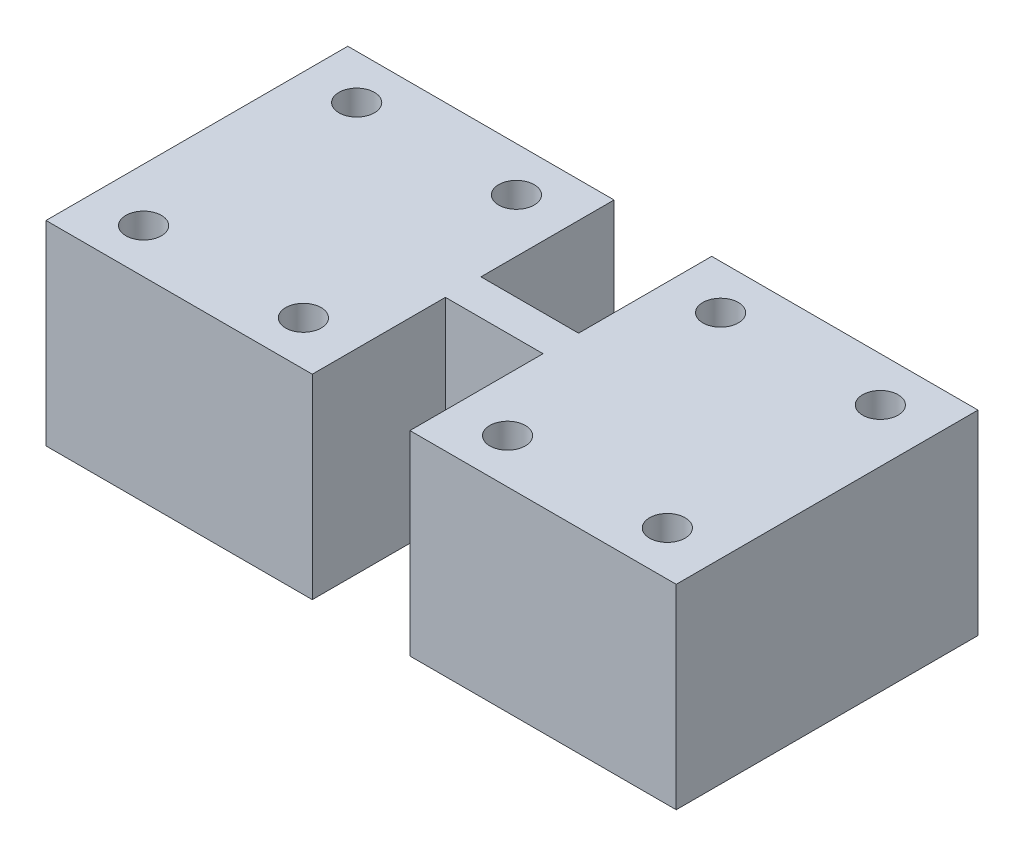
ISO-10303-21;
HEADER;
FILE_DESCRIPTION(('STEP AP214'),'2;1');
FILE_NAME('part.step','',(''),(''),'','','');
FILE_SCHEMA(('AUTOMOTIVE_DESIGN { 1 0 10303 214 1 1 1 1 }'));
ENDSEC;
DATA;
#1=APPLICATION_CONTEXT('core data for automotive mechanical design processes');
#2=APPLICATION_PROTOCOL_DEFINITION('international standard','automotive_design',2000,#1);
#3=PRODUCT_CONTEXT('',#1,'mechanical');
#4=PRODUCT('Part','Part','',(#3));
#5=PRODUCT_RELATED_PRODUCT_CATEGORY('part','',(#4));
#6=PRODUCT_DEFINITION_FORMATION('','',#4);
#7=PRODUCT_DEFINITION_CONTEXT('part definition',#1,'design');
#8=PRODUCT_DEFINITION('design','',#6,#7);
#9=PRODUCT_DEFINITION_SHAPE('','',#8);
#10=(LENGTH_UNIT() NAMED_UNIT(*) SI_UNIT(.MILLI.,.METRE.));
#11=(NAMED_UNIT(*) PLANE_ANGLE_UNIT() SI_UNIT($,.RADIAN.));
#12=(NAMED_UNIT(*) SI_UNIT($,.STERADIAN.) SOLID_ANGLE_UNIT());
#13=UNCERTAINTY_MEASURE_WITH_UNIT(LENGTH_MEASURE(1.E-05),#10,'distance_accuracy_value','');
#14=(GEOMETRIC_REPRESENTATION_CONTEXT(3) GLOBAL_UNCERTAINTY_ASSIGNED_CONTEXT((#13)) GLOBAL_UNIT_ASSIGNED_CONTEXT((#10,
#11,#12)) REPRESENTATION_CONTEXT('',''));
#15=CARTESIAN_POINT('',(0.,0.,0.));
#16=DIRECTION('',(0.,0.,1.));
#17=DIRECTION('',(1.,0.,0.));
#18=AXIS2_PLACEMENT_3D('',#15,#16,#17);
#19=CARTESIAN_POINT('',(0.,22.,0.));
#20=DIRECTION('',(0.,-1.,0.));
#21=DIRECTION('',(0.,0.,-1.));
#22=AXIS2_PLACEMENT_3D('',#19,#20,#21);
#23=PLANE('',#22);
#24=DIRECTION('',(1.,0.,0.));
#25=VECTOR('',#24,1.);
#26=CARTESIAN_POINT('',(30.,22.,0.));
#27=LINE('',#26,#25);
#28=CARTESIAN_POINT('',(0.,22.,0.));
#29=VERTEX_POINT('',#28);
#30=CARTESIAN_POINT('',(30.,22.,0.));
#31=VERTEX_POINT('',#30);
#32=EDGE_CURVE('E178',#29,#31,#27,.T.);
#33=ORIENTED_EDGE('',*,*,#32,.T.);
#34=DIRECTION('',(0.,0.,-1.));
#35=VECTOR('',#34,1.);
#36=CARTESIAN_POINT('',(30.,22.,-15.));
#37=LINE('',#36,#35);
#38=CARTESIAN_POINT('',(30.,22.,-15.));
#39=VERTEX_POINT('',#38);
#40=EDGE_CURVE('E106',#31,#39,#37,.T.);
#41=ORIENTED_EDGE('',*,*,#40,.T.);
#42=DIRECTION('',(1.,0.,0.));
#43=VECTOR('',#42,1.);
#44=CARTESIAN_POINT('',(30.,22.,-15.));
#45=LINE('',#44,#43);
#46=CARTESIAN_POINT('',(41.,22.,-15.));
#47=VERTEX_POINT('',#46);
#48=EDGE_CURVE('E205',#39,#47,#45,.T.);
#49=ORIENTED_EDGE('',*,*,#48,.T.);
#50=DIRECTION('',(0.,0.,1.));
#51=VECTOR('',#50,1.);
#52=CARTESIAN_POINT('',(41.,22.,0.));
#53=LINE('',#52,#51);
#54=CARTESIAN_POINT('',(41.,22.,0.));
#55=VERTEX_POINT('',#54);
#56=EDGE_CURVE('E224',#47,#55,#53,.T.);
#57=ORIENTED_EDGE('',*,*,#56,.T.);
#58=DIRECTION('',(1.,0.,0.));
#59=VECTOR('',#58,1.);
#60=CARTESIAN_POINT('',(71.,22.,0.));
#61=LINE('',#60,#59);
#62=CARTESIAN_POINT('',(71.,22.,0.));
#63=VERTEX_POINT('',#62);
#64=EDGE_CURVE('E221',#55,#63,#61,.T.);
#65=ORIENTED_EDGE('',*,*,#64,.T.);
#66=DIRECTION('',(0.,0.,-1.));
#67=VECTOR('',#66,1.);
#68=CARTESIAN_POINT('',(71.,22.,-34.));
#69=LINE('',#68,#67);
#70=CARTESIAN_POINT('',(71.,22.,-34.));
#71=VERTEX_POINT('',#70);
#72=EDGE_CURVE('E223',#63,#71,#69,.T.);
#73=ORIENTED_EDGE('',*,*,#72,.T.);
#74=DIRECTION('',(-1.,0.,0.));
#75=VECTOR('',#74,1.);
#76=CARTESIAN_POINT('',(41.,22.,-34.));
#77=LINE('',#76,#75);
#78=CARTESIAN_POINT('',(41.,22.,-34.));
#79=VERTEX_POINT('',#78);
#80=EDGE_CURVE('E226',#71,#79,#77,.T.);
#81=ORIENTED_EDGE('',*,*,#80,.T.);
#82=DIRECTION('',(0.,0.,1.));
#83=VECTOR('',#82,1.);
#84=CARTESIAN_POINT('',(41.,22.,-19.));
#85=LINE('',#84,#83);
#86=CARTESIAN_POINT('',(41.,22.,-19.));
#87=VERTEX_POINT('',#86);
#88=EDGE_CURVE('E232',#79,#87,#85,.T.);
#89=ORIENTED_EDGE('',*,*,#88,.T.);
#90=DIRECTION('',(-1.,0.,0.));
#91=VECTOR('',#90,1.);
#92=CARTESIAN_POINT('',(30.,22.,-19.));
#93=LINE('',#92,#91);
#94=CARTESIAN_POINT('',(30.,22.,-19.));
#95=VERTEX_POINT('',#94);
#96=EDGE_CURVE('E137',#87,#95,#93,.T.);
#97=ORIENTED_EDGE('',*,*,#96,.T.);
#98=DIRECTION('',(0.,0.,-1.));
#99=VECTOR('',#98,1.);
#100=CARTESIAN_POINT('',(30.,22.,-34.));
#101=LINE('',#100,#99);
#102=CARTESIAN_POINT('',(30.,22.,-34.));
#103=VERTEX_POINT('',#102);
#104=EDGE_CURVE('E131',#95,#103,#101,.T.);
#105=ORIENTED_EDGE('',*,*,#104,.T.);
#106=DIRECTION('',(-1.,0.,0.));
#107=VECTOR('',#106,1.);
#108=CARTESIAN_POINT('',(0.,22.,-34.));
#109=LINE('',#108,#107);
#110=CARTESIAN_POINT('',(0.,22.,-34.));
#111=VERTEX_POINT('',#110);
#112=EDGE_CURVE('E135',#103,#111,#109,.T.);
#113=ORIENTED_EDGE('',*,*,#112,.T.);
#114=DIRECTION('',(0.,0.,1.));
#115=VECTOR('',#114,1.);
#116=CARTESIAN_POINT('',(0.,22.,0.));
#117=LINE('',#116,#115);
#118=EDGE_CURVE('E51',#111,#29,#117,.T.);
#119=ORIENTED_EDGE('',*,*,#118,.T.);
#120=EDGE_LOOP('',(#33,#41,#49,#57,#65,#73,#81,#89,#97,#105,#113,#119));
#121=FACE_BOUND('',#120,.T.);
#122=CARTESIAN_POINT('',(6.,22.,-29.));
#123=DIRECTION('',(0.,1.,0.));
#124=DIRECTION('',(0.,0.,1.));
#125=AXIS2_PLACEMENT_3D('',#122,#123,#124);
#126=CIRCLE('',#125,2.);
#127=CARTESIAN_POINT('',(6.,22.,-27.));
#128=VERTEX_POINT('',#127);
#129=EDGE_CURVE('E159',#128,#128,#126,.T.);
#130=ORIENTED_EDGE('',*,*,#129,.F.);
#131=EDGE_LOOP('',(#130));
#132=FACE_BOUND('',#131,.T.);
#133=CARTESIAN_POINT('',(24.,22.,-29.));
#134=DIRECTION('',(0.,1.,0.));
#135=DIRECTION('',(0.,0.,-1.));
#136=AXIS2_PLACEMENT_3D('',#133,#134,#135);
#137=CIRCLE('',#136,2.00000000000001);
#138=CARTESIAN_POINT('',(24.,22.,-31.));
#139=VERTEX_POINT('',#138);
#140=EDGE_CURVE('E336',#139,#139,#137,.T.);
#141=ORIENTED_EDGE('',*,*,#140,.F.);
#142=EDGE_LOOP('',(#141));
#143=FACE_BOUND('',#142,.T.);
#144=CARTESIAN_POINT('',(24.,22.,-5.));
#145=DIRECTION('',(0.,1.,0.));
#146=DIRECTION('',(0.,0.,1.));
#147=AXIS2_PLACEMENT_3D('',#144,#145,#146);
#148=CIRCLE('',#147,2.);
#149=CARTESIAN_POINT('',(24.,22.,-3.));
#150=VERTEX_POINT('',#149);
#151=EDGE_CURVE('E330',#150,#150,#148,.T.);
#152=ORIENTED_EDGE('',*,*,#151,.F.);
#153=EDGE_LOOP('',(#152));
#154=FACE_BOUND('',#153,.T.);
#155=CARTESIAN_POINT('',(6.,22.,-5.));
#156=DIRECTION('',(0.,1.,0.));
#157=DIRECTION('',(0.,0.,-1.));
#158=AXIS2_PLACEMENT_3D('',#155,#156,#157);
#159=CIRCLE('',#158,2.);
#160=CARTESIAN_POINT('',(6.,22.,-7.));
#161=VERTEX_POINT('',#160);
#162=EDGE_CURVE('E324',#161,#161,#159,.T.);
#163=ORIENTED_EDGE('',*,*,#162,.F.);
#164=EDGE_LOOP('',(#163));
#165=FACE_BOUND('',#164,.T.);
#166=CARTESIAN_POINT('',(47.,22.,-29.));
#167=DIRECTION('',(0.,1.,0.));
#168=DIRECTION('',(0.,0.,1.));
#169=AXIS2_PLACEMENT_3D('',#166,#167,#168);
#170=CIRCLE('',#169,2.);
#171=CARTESIAN_POINT('',(47.,22.,-27.));
#172=VERTEX_POINT('',#171);
#173=EDGE_CURVE('E318',#172,#172,#170,.T.);
#174=ORIENTED_EDGE('',*,*,#173,.F.);
#175=EDGE_LOOP('',(#174));
#176=FACE_BOUND('',#175,.T.);
#177=CARTESIAN_POINT('',(47.,22.,-4.99999999999999));
#178=DIRECTION('',(0.,1.,0.));
#179=DIRECTION('',(0.,0.,-1.));
#180=AXIS2_PLACEMENT_3D('',#177,#178,#179);
#181=CIRCLE('',#180,2.);
#182=CARTESIAN_POINT('',(47.,22.,-7.));
#183=VERTEX_POINT('',#182);
#184=EDGE_CURVE('E312',#183,#183,#181,.T.);
#185=ORIENTED_EDGE('',*,*,#184,.F.);
#186=EDGE_LOOP('',(#185));
#187=FACE_BOUND('',#186,.T.);
#188=CARTESIAN_POINT('',(65.,22.,-4.99999999999999));
#189=DIRECTION('',(0.,1.,0.));
#190=DIRECTION('',(0.,0.,1.));
#191=AXIS2_PLACEMENT_3D('',#188,#189,#190);
#192=CIRCLE('',#191,2.00000000000001);
#193=CARTESIAN_POINT('',(65.,22.,-2.99999999999998));
#194=VERTEX_POINT('',#193);
#195=EDGE_CURVE('E306',#194,#194,#192,.T.);
#196=ORIENTED_EDGE('',*,*,#195,.F.);
#197=EDGE_LOOP('',(#196));
#198=FACE_BOUND('',#197,.T.);
#199=CARTESIAN_POINT('',(65.,22.,-29.));
#200=DIRECTION('',(0.,1.,0.));
#201=DIRECTION('',(0.,0.,-1.));
#202=AXIS2_PLACEMENT_3D('',#199,#200,#201);
#203=CIRCLE('',#202,2.00000000000001);
#204=CARTESIAN_POINT('',(65.,22.,-31.));
#205=VERTEX_POINT('',#204);
#206=EDGE_CURVE('E297',#205,#205,#203,.T.);
#207=ORIENTED_EDGE('',*,*,#206,.F.);
#208=EDGE_LOOP('',(#207));
#209=FACE_BOUND('',#208,.T.);
#210=ADVANCED_FACE('F34',(#121,#132,#143,#154,#165,#176,#187,#198,#209),#23,.F.);
#211=CARTESIAN_POINT('',(0.,0.,0.));
#212=DIRECTION('',(0.,-1.,0.));
#213=DIRECTION('',(0.,0.,-1.));
#214=AXIS2_PLACEMENT_3D('',#211,#212,#213);
#215=PLANE('',#214);
#216=CARTESIAN_POINT('',(65.,0.,-4.99999999999999));
#217=DIRECTION('',(0.,1.,0.));
#218=DIRECTION('',(0.,0.,1.));
#219=AXIS2_PLACEMENT_3D('',#216,#217,#218);
#220=CIRCLE('',#219,2.00000000000001);
#221=CARTESIAN_POINT('',(65.,0.,-2.99999999999998));
#222=VERTEX_POINT('',#221);
#223=EDGE_CURVE('E303',#222,#222,#220,.T.);
#224=ORIENTED_EDGE('',*,*,#223,.T.);
#225=EDGE_LOOP('',(#224));
#226=FACE_BOUND('',#225,.T.);
#227=CARTESIAN_POINT('',(47.,0.,-29.));
#228=DIRECTION('',(0.,1.,0.));
#229=DIRECTION('',(0.,0.,1.));
#230=AXIS2_PLACEMENT_3D('',#227,#228,#229);
#231=CIRCLE('',#230,2.);
#232=CARTESIAN_POINT('',(47.,0.,-27.));
#233=VERTEX_POINT('',#232);
#234=EDGE_CURVE('E315',#233,#233,#231,.T.);
#235=ORIENTED_EDGE('',*,*,#234,.T.);
#236=EDGE_LOOP('',(#235));
#237=FACE_BOUND('',#236,.T.);
#238=CARTESIAN_POINT('',(24.,0.,-5.));
#239=DIRECTION('',(0.,1.,0.));
#240=DIRECTION('',(0.,0.,1.));
#241=AXIS2_PLACEMENT_3D('',#238,#239,#240);
#242=CIRCLE('',#241,2.);
#243=CARTESIAN_POINT('',(24.,0.,-3.));
#244=VERTEX_POINT('',#243);
#245=EDGE_CURVE('E327',#244,#244,#242,.T.);
#246=ORIENTED_EDGE('',*,*,#245,.T.);
#247=EDGE_LOOP('',(#246));
#248=FACE_BOUND('',#247,.T.);
#249=CARTESIAN_POINT('',(6.,0.,-29.));
#250=DIRECTION('',(0.,1.,0.));
#251=DIRECTION('',(0.,0.,1.));
#252=AXIS2_PLACEMENT_3D('',#249,#250,#251);
#253=CIRCLE('',#252,2.);
#254=CARTESIAN_POINT('',(6.,0.,-27.));
#255=VERTEX_POINT('',#254);
#256=EDGE_CURVE('E339',#255,#255,#253,.T.);
#257=ORIENTED_EDGE('',*,*,#256,.T.);
#258=EDGE_LOOP('',(#257));
#259=FACE_BOUND('',#258,.T.);
#260=DIRECTION('',(1.,0.,0.));
#261=VECTOR('',#260,1.);
#262=CARTESIAN_POINT('',(30.,0.,0.));
#263=LINE('',#262,#261);
#264=CARTESIAN_POINT('',(0.,0.,0.));
#265=VERTEX_POINT('',#264);
#266=CARTESIAN_POINT('',(30.,0.,0.));
#267=VERTEX_POINT('',#266);
#268=EDGE_CURVE('E155',#265,#267,#263,.T.);
#269=ORIENTED_EDGE('',*,*,#268,.F.);
#270=DIRECTION('',(0.,0.,1.));
#271=VECTOR('',#270,1.);
#272=CARTESIAN_POINT('',(0.,0.,0.));
#273=LINE('',#272,#271);
#274=CARTESIAN_POINT('',(0.,0.,-34.));
#275=VERTEX_POINT('',#274);
#276=EDGE_CURVE('E98',#275,#265,#273,.T.);
#277=ORIENTED_EDGE('',*,*,#276,.F.);
#278=DIRECTION('',(-1.,0.,0.));
#279=VECTOR('',#278,1.);
#280=CARTESIAN_POINT('',(0.,0.,-34.));
#281=LINE('',#280,#279);
#282=CARTESIAN_POINT('',(30.,0.,-34.));
#283=VERTEX_POINT('',#282);
#284=EDGE_CURVE('E92',#283,#275,#281,.T.);
#285=ORIENTED_EDGE('',*,*,#284,.F.);
#286=DIRECTION('',(0.,0.,-1.));
#287=VECTOR('',#286,1.);
#288=CARTESIAN_POINT('',(30.,0.,-34.));
#289=LINE('',#288,#287);
#290=CARTESIAN_POINT('',(30.,0.,-19.));
#291=VERTEX_POINT('',#290);
#292=EDGE_CURVE('E145',#291,#283,#289,.T.);
#293=ORIENTED_EDGE('',*,*,#292,.F.);
#294=DIRECTION('',(-1.,0.,0.));
#295=VECTOR('',#294,1.);
#296=CARTESIAN_POINT('',(30.,0.,-19.));
#297=LINE('',#296,#295);
#298=CARTESIAN_POINT('',(41.,0.,-19.));
#299=VERTEX_POINT('',#298);
#300=EDGE_CURVE('E173',#299,#291,#297,.T.);
#301=ORIENTED_EDGE('',*,*,#300,.F.);
#302=DIRECTION('',(0.,0.,1.));
#303=VECTOR('',#302,1.);
#304=CARTESIAN_POINT('',(41.,0.,-19.));
#305=LINE('',#304,#303);
#306=CARTESIAN_POINT('',(41.,0.,-34.));
#307=VERTEX_POINT('',#306);
#308=EDGE_CURVE('E171',#307,#299,#305,.T.);
#309=ORIENTED_EDGE('',*,*,#308,.F.);
#310=DIRECTION('',(-1.,0.,0.));
#311=VECTOR('',#310,1.);
#312=CARTESIAN_POINT('',(41.,0.,-34.));
#313=LINE('',#312,#311);
#314=CARTESIAN_POINT('',(71.,0.,-34.));
#315=VERTEX_POINT('',#314);
#316=EDGE_CURVE('E169',#315,#307,#313,.T.);
#317=ORIENTED_EDGE('',*,*,#316,.F.);
#318=DIRECTION('',(0.,0.,-1.));
#319=VECTOR('',#318,1.);
#320=CARTESIAN_POINT('',(71.,0.,-34.));
#321=LINE('',#320,#319);
#322=CARTESIAN_POINT('',(71.,0.,0.));
#323=VERTEX_POINT('',#322);
#324=EDGE_CURVE('E167',#323,#315,#321,.T.);
#325=ORIENTED_EDGE('',*,*,#324,.F.);
#326=DIRECTION('',(1.,0.,0.));
#327=VECTOR('',#326,1.);
#328=CARTESIAN_POINT('',(71.,0.,0.));
#329=LINE('',#328,#327);
#330=CARTESIAN_POINT('',(41.,0.,0.));
#331=VERTEX_POINT('',#330);
#332=EDGE_CURVE('E165',#331,#323,#329,.T.);
#333=ORIENTED_EDGE('',*,*,#332,.F.);
#334=DIRECTION('',(0.,0.,1.));
#335=VECTOR('',#334,1.);
#336=CARTESIAN_POINT('',(41.,0.,0.));
#337=LINE('',#336,#335);
#338=CARTESIAN_POINT('',(41.,0.,-15.));
#339=VERTEX_POINT('',#338);
#340=EDGE_CURVE('E163',#339,#331,#337,.T.);
#341=ORIENTED_EDGE('',*,*,#340,.F.);
#342=DIRECTION('',(1.,0.,0.));
#343=VECTOR('',#342,1.);
#344=CARTESIAN_POINT('',(30.,0.,-15.));
#345=LINE('',#344,#343);
#346=CARTESIAN_POINT('',(30.,0.,-15.));
#347=VERTEX_POINT('',#346);
#348=EDGE_CURVE('E161',#347,#339,#345,.T.);
#349=ORIENTED_EDGE('',*,*,#348,.F.);
#350=DIRECTION('',(0.,0.,-1.));
#351=VECTOR('',#350,1.);
#352=CARTESIAN_POINT('',(30.,0.,-15.));
#353=LINE('',#352,#351);
#354=EDGE_CURVE('E158',#267,#347,#353,.T.);
#355=ORIENTED_EDGE('',*,*,#354,.F.);
#356=EDGE_LOOP('',(#269,#277,#285,#293,#301,#309,#317,#325,#333,#341,#349,#355));
#357=FACE_BOUND('',#356,.T.);
#358=CARTESIAN_POINT('',(24.,0.,-29.));
#359=DIRECTION('',(0.,1.,0.));
#360=DIRECTION('',(0.,0.,-1.));
#361=AXIS2_PLACEMENT_3D('',#358,#359,#360);
#362=CIRCLE('',#361,2.00000000000001);
#363=CARTESIAN_POINT('',(24.,0.,-31.));
#364=VERTEX_POINT('',#363);
#365=EDGE_CURVE('E333',#364,#364,#362,.T.);
#366=ORIENTED_EDGE('',*,*,#365,.T.);
#367=EDGE_LOOP('',(#366));
#368=FACE_BOUND('',#367,.T.);
#369=CARTESIAN_POINT('',(6.,0.,-5.));
#370=DIRECTION('',(0.,1.,0.));
#371=DIRECTION('',(0.,0.,-1.));
#372=AXIS2_PLACEMENT_3D('',#369,#370,#371);
#373=CIRCLE('',#372,2.);
#374=CARTESIAN_POINT('',(6.,0.,-7.));
#375=VERTEX_POINT('',#374);
#376=EDGE_CURVE('E321',#375,#375,#373,.T.);
#377=ORIENTED_EDGE('',*,*,#376,.T.);
#378=EDGE_LOOP('',(#377));
#379=FACE_BOUND('',#378,.T.);
#380=CARTESIAN_POINT('',(47.,0.,-4.99999999999999));
#381=DIRECTION('',(0.,1.,0.));
#382=DIRECTION('',(0.,0.,-1.));
#383=AXIS2_PLACEMENT_3D('',#380,#381,#382);
#384=CIRCLE('',#383,2.);
#385=CARTESIAN_POINT('',(47.,0.,-7.));
#386=VERTEX_POINT('',#385);
#387=EDGE_CURVE('E309',#386,#386,#384,.T.);
#388=ORIENTED_EDGE('',*,*,#387,.T.);
#389=EDGE_LOOP('',(#388));
#390=FACE_BOUND('',#389,.T.);
#391=CARTESIAN_POINT('',(65.,0.,-29.));
#392=DIRECTION('',(0.,1.,0.));
#393=DIRECTION('',(0.,0.,-1.));
#394=AXIS2_PLACEMENT_3D('',#391,#392,#393);
#395=CIRCLE('',#394,2.00000000000001);
#396=CARTESIAN_POINT('',(65.,0.,-31.));
#397=VERTEX_POINT('',#396);
#398=EDGE_CURVE('E300',#397,#397,#395,.T.);
#399=ORIENTED_EDGE('',*,*,#398,.T.);
#400=EDGE_LOOP('',(#399));
#401=FACE_BOUND('',#400,.T.);
#402=ADVANCED_FACE('F209',(#226,#237,#248,#259,#357,#368,#379,#390,#401),#215,.T.);
#403=CARTESIAN_POINT('',(30.,22.,0.));
#404=DIRECTION('',(0.,0.,-1.));
#405=DIRECTION('',(-1.,0.,0.));
#406=AXIS2_PLACEMENT_3D('',#403,#404,#405);
#407=PLANE('',#406);
#408=ORIENTED_EDGE('',*,*,#268,.T.);
#409=DIRECTION('',(0.,-1.,0.));
#410=VECTOR('',#409,1.);
#411=CARTESIAN_POINT('',(30.,22.,0.));
#412=LINE('',#411,#410);
#413=EDGE_CURVE('E11',#31,#267,#412,.T.);
#414=ORIENTED_EDGE('',*,*,#413,.F.);
#415=ORIENTED_EDGE('',*,*,#32,.F.);
#416=DIRECTION('',(0.,-1.,0.));
#417=VECTOR('',#416,1.);
#418=CARTESIAN_POINT('',(0.,22.,0.));
#419=LINE('',#418,#417);
#420=EDGE_CURVE('E151',#29,#265,#419,.T.);
#421=ORIENTED_EDGE('',*,*,#420,.T.);
#422=EDGE_LOOP('',(#408,#414,#415,#421));
#423=FACE_BOUND('',#422,.T.);
#424=ADVANCED_FACE('F36',(#423),#407,.F.);
#425=CARTESIAN_POINT('',(30.,22.,-15.));
#426=DIRECTION('',(-1.,0.,0.));
#427=DIRECTION('',(0.,0.,1.));
#428=AXIS2_PLACEMENT_3D('',#425,#426,#427);
#429=PLANE('',#428);
#430=ORIENTED_EDGE('',*,*,#354,.T.);
#431=DIRECTION('',(0.,-1.,0.));
#432=VECTOR('',#431,1.);
#433=CARTESIAN_POINT('',(30.,22.,-15.));
#434=LINE('',#433,#432);
#435=EDGE_CURVE('E43',#39,#347,#434,.T.);
#436=ORIENTED_EDGE('',*,*,#435,.F.);
#437=ORIENTED_EDGE('',*,*,#40,.F.);
#438=ORIENTED_EDGE('',*,*,#413,.T.);
#439=EDGE_LOOP('',(#430,#436,#437,#438));
#440=FACE_BOUND('',#439,.T.);
#441=ADVANCED_FACE('F487',(#440),#429,.F.);
#442=CARTESIAN_POINT('',(30.,22.,-15.));
#443=DIRECTION('',(0.,0.,-1.));
#444=DIRECTION('',(-1.,0.,0.));
#445=AXIS2_PLACEMENT_3D('',#442,#443,#444);
#446=PLANE('',#445);
#447=ORIENTED_EDGE('',*,*,#348,.T.);
#448=DIRECTION('',(0.,-1.,0.));
#449=VECTOR('',#448,1.);
#450=CARTESIAN_POINT('',(41.,22.,-15.));
#451=LINE('',#450,#449);
#452=EDGE_CURVE('E197',#47,#339,#451,.T.);
#453=ORIENTED_EDGE('',*,*,#452,.F.);
#454=ORIENTED_EDGE('',*,*,#48,.F.);
#455=ORIENTED_EDGE('',*,*,#435,.T.);
#456=EDGE_LOOP('',(#447,#453,#454,#455));
#457=FACE_BOUND('',#456,.T.);
#458=ADVANCED_FACE('F203',(#457),#446,.F.);
#459=CARTESIAN_POINT('',(41.,22.,0.));
#460=DIRECTION('',(1.,0.,0.));
#461=DIRECTION('',(0.,0.,-1.));
#462=AXIS2_PLACEMENT_3D('',#459,#460,#461);
#463=PLANE('',#462);
#464=ORIENTED_EDGE('',*,*,#340,.T.);
#465=DIRECTION('',(0.,-1.,0.));
#466=VECTOR('',#465,1.);
#467=CARTESIAN_POINT('',(41.,22.,0.));
#468=LINE('',#467,#466);
#469=EDGE_CURVE('E194',#55,#331,#468,.T.);
#470=ORIENTED_EDGE('',*,*,#469,.F.);
#471=ORIENTED_EDGE('',*,*,#56,.F.);
#472=ORIENTED_EDGE('',*,*,#452,.T.);
#473=EDGE_LOOP('',(#464,#470,#471,#472));
#474=FACE_BOUND('',#473,.T.);
#475=ADVANCED_FACE('F215',(#474),#463,.F.);
#476=CARTESIAN_POINT('',(71.,22.,0.));
#477=DIRECTION('',(0.,0.,-1.));
#478=DIRECTION('',(-1.,0.,0.));
#479=AXIS2_PLACEMENT_3D('',#476,#477,#478);
#480=PLANE('',#479);
#481=ORIENTED_EDGE('',*,*,#332,.T.);
#482=DIRECTION('',(0.,-1.,0.));
#483=VECTOR('',#482,1.);
#484=CARTESIAN_POINT('',(71.,22.,0.));
#485=LINE('',#484,#483);
#486=EDGE_CURVE('E191',#63,#323,#485,.T.);
#487=ORIENTED_EDGE('',*,*,#486,.F.);
#488=ORIENTED_EDGE('',*,*,#64,.F.);
#489=ORIENTED_EDGE('',*,*,#469,.T.);
#490=EDGE_LOOP('',(#481,#487,#488,#489));
#491=FACE_BOUND('',#490,.T.);
#492=ADVANCED_FACE('F219',(#491),#480,.F.);
#493=CARTESIAN_POINT('',(71.,22.,-34.));
#494=DIRECTION('',(-1.,0.,0.));
#495=DIRECTION('',(0.,0.,1.));
#496=AXIS2_PLACEMENT_3D('',#493,#494,#495);
#497=PLANE('',#496);
#498=ORIENTED_EDGE('',*,*,#324,.T.);
#499=DIRECTION('',(0.,-1.,0.));
#500=VECTOR('',#499,1.);
#501=CARTESIAN_POINT('',(71.,22.,-34.));
#502=LINE('',#501,#500);
#503=EDGE_CURVE('E188',#71,#315,#502,.T.);
#504=ORIENTED_EDGE('',*,*,#503,.F.);
#505=ORIENTED_EDGE('',*,*,#72,.F.);
#506=ORIENTED_EDGE('',*,*,#486,.T.);
#507=EDGE_LOOP('',(#498,#504,#505,#506));
#508=FACE_BOUND('',#507,.T.);
#509=ADVANCED_FACE('F452',(#508),#497,.F.);
#510=CARTESIAN_POINT('',(41.,22.,-34.));
#511=DIRECTION('',(0.,0.,1.));
#512=DIRECTION('',(1.,0.,0.));
#513=AXIS2_PLACEMENT_3D('',#510,#511,#512);
#514=PLANE('',#513);
#515=ORIENTED_EDGE('',*,*,#316,.T.);
#516=DIRECTION('',(0.,-1.,0.));
#517=VECTOR('',#516,1.);
#518=CARTESIAN_POINT('',(41.,22.,-34.));
#519=LINE('',#518,#517);
#520=EDGE_CURVE('E185',#79,#307,#519,.T.);
#521=ORIENTED_EDGE('',*,*,#520,.F.);
#522=ORIENTED_EDGE('',*,*,#80,.F.);
#523=ORIENTED_EDGE('',*,*,#503,.T.);
#524=EDGE_LOOP('',(#515,#521,#522,#523));
#525=FACE_BOUND('',#524,.T.);
#526=ADVANCED_FACE('F443',(#525),#514,.F.);
#527=CARTESIAN_POINT('',(41.,22.,-19.));
#528=DIRECTION('',(1.,0.,0.));
#529=DIRECTION('',(0.,0.,-1.));
#530=AXIS2_PLACEMENT_3D('',#527,#528,#529);
#531=PLANE('',#530);
#532=ORIENTED_EDGE('',*,*,#308,.T.);
#533=DIRECTION('',(0.,-1.,0.));
#534=VECTOR('',#533,1.);
#535=CARTESIAN_POINT('',(41.,22.,-19.));
#536=LINE('',#535,#534);
#537=EDGE_CURVE('E182',#87,#299,#536,.T.);
#538=ORIENTED_EDGE('',*,*,#537,.F.);
#539=ORIENTED_EDGE('',*,*,#88,.F.);
#540=ORIENTED_EDGE('',*,*,#520,.T.);
#541=EDGE_LOOP('',(#532,#538,#539,#540));
#542=FACE_BOUND('',#541,.T.);
#543=ADVANCED_FACE('F238',(#542),#531,.F.);
#544=CARTESIAN_POINT('',(30.,22.,-19.));
#545=DIRECTION('',(0.,0.,1.));
#546=DIRECTION('',(1.,0.,0.));
#547=AXIS2_PLACEMENT_3D('',#544,#545,#546);
#548=PLANE('',#547);
#549=ORIENTED_EDGE('',*,*,#300,.T.);
#550=DIRECTION('',(0.,-1.,0.));
#551=VECTOR('',#550,1.);
#552=CARTESIAN_POINT('',(30.,22.,-19.));
#553=LINE('',#552,#551);
#554=EDGE_CURVE('E146',#95,#291,#553,.T.);
#555=ORIENTED_EDGE('',*,*,#554,.F.);
#556=ORIENTED_EDGE('',*,*,#96,.F.);
#557=ORIENTED_EDGE('',*,*,#537,.T.);
#558=EDGE_LOOP('',(#549,#555,#556,#557));
#559=FACE_BOUND('',#558,.T.);
#560=ADVANCED_FACE('F242',(#559),#548,.F.);
#561=CARTESIAN_POINT('',(30.,22.,-34.));
#562=DIRECTION('',(-1.,0.,0.));
#563=DIRECTION('',(0.,0.,1.));
#564=AXIS2_PLACEMENT_3D('',#561,#562,#563);
#565=PLANE('',#564);
#566=ORIENTED_EDGE('',*,*,#292,.T.);
#567=DIRECTION('',(0.,-1.,0.));
#568=VECTOR('',#567,1.);
#569=CARTESIAN_POINT('',(30.,22.,-34.));
#570=LINE('',#569,#568);
#571=EDGE_CURVE('E142',#103,#283,#570,.T.);
#572=ORIENTED_EDGE('',*,*,#571,.F.);
#573=ORIENTED_EDGE('',*,*,#104,.F.);
#574=ORIENTED_EDGE('',*,*,#554,.T.);
#575=EDGE_LOOP('',(#566,#572,#573,#574));
#576=FACE_BOUND('',#575,.T.);
#577=ADVANCED_FACE('F143',(#576),#565,.F.);
#578=CARTESIAN_POINT('',(0.,22.,-34.));
#579=DIRECTION('',(0.,0.,1.));
#580=DIRECTION('',(1.,0.,0.));
#581=AXIS2_PLACEMENT_3D('',#578,#579,#580);
#582=PLANE('',#581);
#583=ORIENTED_EDGE('',*,*,#284,.T.);
#584=DIRECTION('',(0.,-1.,0.));
#585=VECTOR('',#584,1.);
#586=CARTESIAN_POINT('',(0.,22.,-34.));
#587=LINE('',#586,#585);
#588=EDGE_CURVE('E147',#111,#275,#587,.T.);
#589=ORIENTED_EDGE('',*,*,#588,.F.);
#590=ORIENTED_EDGE('',*,*,#112,.F.);
#591=ORIENTED_EDGE('',*,*,#571,.T.);
#592=EDGE_LOOP('',(#583,#589,#590,#591));
#593=FACE_BOUND('',#592,.T.);
#594=ADVANCED_FACE('F149',(#593),#582,.F.);
#595=CARTESIAN_POINT('',(0.,22.,0.));
#596=DIRECTION('',(1.,0.,0.));
#597=DIRECTION('',(0.,0.,-1.));
#598=AXIS2_PLACEMENT_3D('',#595,#596,#597);
#599=PLANE('',#598);
#600=ORIENTED_EDGE('',*,*,#276,.T.);
#601=ORIENTED_EDGE('',*,*,#420,.F.);
#602=ORIENTED_EDGE('',*,*,#118,.F.);
#603=ORIENTED_EDGE('',*,*,#588,.T.);
#604=EDGE_LOOP('',(#600,#601,#602,#603));
#605=FACE_BOUND('',#604,.T.);
#606=ADVANCED_FACE('F246',(#605),#599,.F.);
#607=CARTESIAN_POINT('',(6.,22.,-29.));
#608=DIRECTION('',(0.,-1.,0.));
#609=DIRECTION('',(0.,0.,-1.));
#610=AXIS2_PLACEMENT_3D('',#607,#608,#609);
#611=CYLINDRICAL_SURFACE('',#610,2.);
#612=ORIENTED_EDGE('',*,*,#129,.T.);
#613=EDGE_LOOP('',(#612));
#614=FACE_BOUND('',#613,.T.);
#615=ORIENTED_EDGE('',*,*,#256,.F.);
#616=EDGE_LOOP('',(#615));
#617=FACE_BOUND('',#616,.T.);
#618=ADVANCED_FACE('F248',(#614,#617),#611,.F.);
#619=CARTESIAN_POINT('',(24.,22.,-29.));
#620=DIRECTION('',(0.,-1.,0.));
#621=DIRECTION('',(0.,0.,-1.));
#622=AXIS2_PLACEMENT_3D('',#619,#620,#621);
#623=CYLINDRICAL_SURFACE('',#622,2.00000000000001);
#624=ORIENTED_EDGE('',*,*,#140,.T.);
#625=EDGE_LOOP('',(#624));
#626=FACE_BOUND('',#625,.T.);
#627=ORIENTED_EDGE('',*,*,#365,.F.);
#628=EDGE_LOOP('',(#627));
#629=FACE_BOUND('',#628,.T.);
#630=ADVANCED_FACE('F254',(#626,#629),#623,.F.);
#631=CARTESIAN_POINT('',(24.,22.,-5.));
#632=DIRECTION('',(0.,-1.,0.));
#633=DIRECTION('',(0.,0.,-1.));
#634=AXIS2_PLACEMENT_3D('',#631,#632,#633);
#635=CYLINDRICAL_SURFACE('',#634,2.);
#636=ORIENTED_EDGE('',*,*,#151,.T.);
#637=EDGE_LOOP('',(#636));
#638=FACE_BOUND('',#637,.T.);
#639=ORIENTED_EDGE('',*,*,#245,.F.);
#640=EDGE_LOOP('',(#639));
#641=FACE_BOUND('',#640,.T.);
#642=ADVANCED_FACE('F268',(#638,#641),#635,.F.);
#643=CARTESIAN_POINT('',(6.,22.,-5.));
#644=DIRECTION('',(0.,-1.,0.));
#645=DIRECTION('',(0.,0.,-1.));
#646=AXIS2_PLACEMENT_3D('',#643,#644,#645);
#647=CYLINDRICAL_SURFACE('',#646,2.);
#648=ORIENTED_EDGE('',*,*,#162,.T.);
#649=EDGE_LOOP('',(#648));
#650=FACE_BOUND('',#649,.T.);
#651=ORIENTED_EDGE('',*,*,#376,.F.);
#652=EDGE_LOOP('',(#651));
#653=FACE_BOUND('',#652,.T.);
#654=ADVANCED_FACE('F272',(#650,#653),#647,.F.);
#655=CARTESIAN_POINT('',(47.,22.,-29.));
#656=DIRECTION('',(0.,-1.,0.));
#657=DIRECTION('',(0.,0.,-1.));
#658=AXIS2_PLACEMENT_3D('',#655,#656,#657);
#659=CYLINDRICAL_SURFACE('',#658,2.);
#660=ORIENTED_EDGE('',*,*,#173,.T.);
#661=EDGE_LOOP('',(#660));
#662=FACE_BOUND('',#661,.T.);
#663=ORIENTED_EDGE('',*,*,#234,.F.);
#664=EDGE_LOOP('',(#663));
#665=FACE_BOUND('',#664,.T.);
#666=ADVANCED_FACE('F276',(#662,#665),#659,.F.);
#667=CARTESIAN_POINT('',(47.,22.,-4.99999999999999));
#668=DIRECTION('',(0.,-1.,0.));
#669=DIRECTION('',(0.,0.,-1.));
#670=AXIS2_PLACEMENT_3D('',#667,#668,#669);
#671=CYLINDRICAL_SURFACE('',#670,2.);
#672=ORIENTED_EDGE('',*,*,#184,.T.);
#673=EDGE_LOOP('',(#672));
#674=FACE_BOUND('',#673,.T.);
#675=ORIENTED_EDGE('',*,*,#387,.F.);
#676=EDGE_LOOP('',(#675));
#677=FACE_BOUND('',#676,.T.);
#678=ADVANCED_FACE('F280',(#674,#677),#671,.F.);
#679=CARTESIAN_POINT('',(65.,22.,-4.99999999999999));
#680=DIRECTION('',(0.,-1.,0.));
#681=DIRECTION('',(0.,0.,-1.));
#682=AXIS2_PLACEMENT_3D('',#679,#680,#681);
#683=CYLINDRICAL_SURFACE('',#682,2.00000000000001);
#684=ORIENTED_EDGE('',*,*,#195,.T.);
#685=EDGE_LOOP('',(#684));
#686=FACE_BOUND('',#685,.T.);
#687=ORIENTED_EDGE('',*,*,#223,.F.);
#688=EDGE_LOOP('',(#687));
#689=FACE_BOUND('',#688,.T.);
#690=ADVANCED_FACE('F284',(#686,#689),#683,.F.);
#691=CARTESIAN_POINT('',(65.,22.,-29.));
#692=DIRECTION('',(0.,-1.,0.));
#693=DIRECTION('',(0.,0.,-1.));
#694=AXIS2_PLACEMENT_3D('',#691,#692,#693);
#695=CYLINDRICAL_SURFACE('',#694,2.00000000000001);
#696=ORIENTED_EDGE('',*,*,#206,.T.);
#697=EDGE_LOOP('',(#696));
#698=FACE_BOUND('',#697,.T.);
#699=ORIENTED_EDGE('',*,*,#398,.F.);
#700=EDGE_LOOP('',(#699));
#701=FACE_BOUND('',#700,.T.);
#702=ADVANCED_FACE('F288',(#698,#701),#695,.F.);
#703=CLOSED_SHELL('',(#210,#402,#424,#441,#458,#475,#492,#509,#526,#543,#560,#577,#594,#606,
#618,#630,#642,#654,#666,#678,#690,#702));
#704=MANIFOLD_SOLID_BREP('B2',#703);
#705=ADVANCED_BREP_SHAPE_REPRESENTATION('',(#18,#704),#14);
#706=SHAPE_DEFINITION_REPRESENTATION(#9,#705);
ENDSEC;
END-ISO-10303-21;
